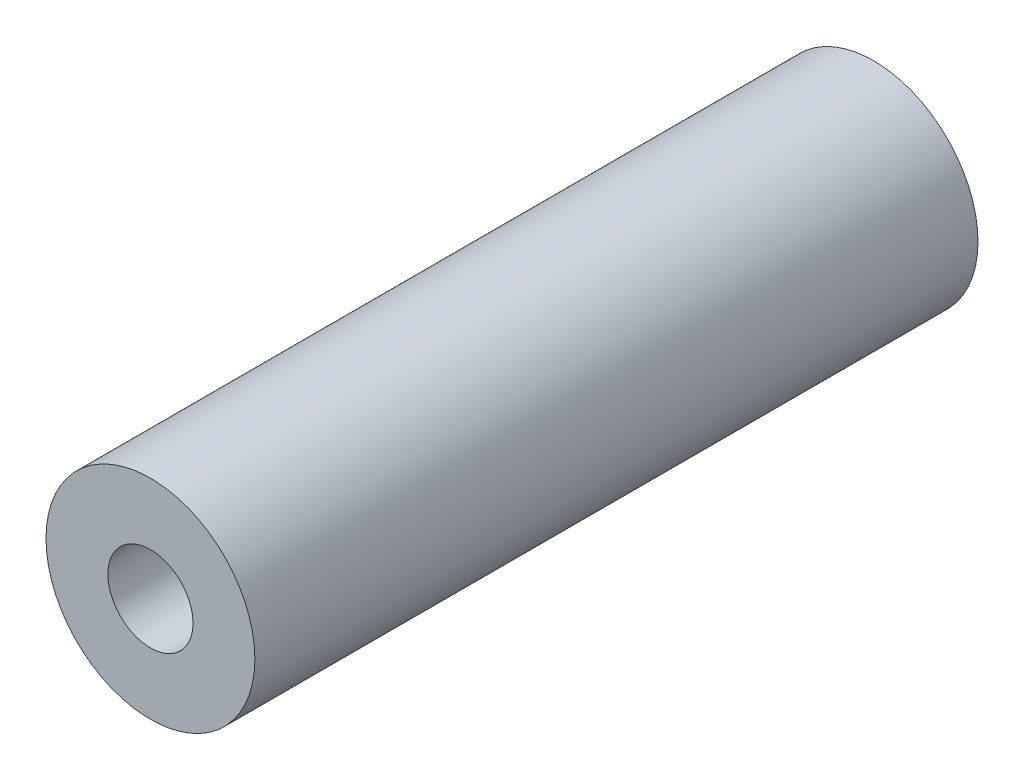
ISO-10303-21;
HEADER;
FILE_DESCRIPTION(('STEP AP214'),'2;1');
FILE_NAME('part.step','',(''),(''),'','','');
FILE_SCHEMA(('AUTOMOTIVE_DESIGN { 1 0 10303 214 1 1 1 1 }'));
ENDSEC;
DATA;
#1=APPLICATION_CONTEXT('core data for automotive mechanical design processes');
#2=APPLICATION_PROTOCOL_DEFINITION('international standard','automotive_design',2000,#1);
#3=PRODUCT_CONTEXT('',#1,'mechanical');
#4=PRODUCT('Part','Part','',(#3));
#5=PRODUCT_RELATED_PRODUCT_CATEGORY('part','',(#4));
#6=PRODUCT_DEFINITION_FORMATION('','',#4);
#7=PRODUCT_DEFINITION_CONTEXT('part definition',#1,'design');
#8=PRODUCT_DEFINITION('design','',#6,#7);
#9=PRODUCT_DEFINITION_SHAPE('','',#8);
#10=(LENGTH_UNIT() NAMED_UNIT(*) SI_UNIT(.MILLI.,.METRE.));
#11=(NAMED_UNIT(*) PLANE_ANGLE_UNIT() SI_UNIT($,.RADIAN.));
#12=(NAMED_UNIT(*) SI_UNIT($,.STERADIAN.) SOLID_ANGLE_UNIT());
#13=UNCERTAINTY_MEASURE_WITH_UNIT(LENGTH_MEASURE(1.E-05),#10,'distance_accuracy_value','');
#14=(GEOMETRIC_REPRESENTATION_CONTEXT(3) GLOBAL_UNCERTAINTY_ASSIGNED_CONTEXT((#13)) GLOBAL_UNIT_ASSIGNED_CONTEXT((#10,
#11,#12)) REPRESENTATION_CONTEXT('',''));
#15=CARTESIAN_POINT('',(0.,0.,0.));
#16=DIRECTION('',(0.,0.,1.));
#17=DIRECTION('',(1.,0.,0.));
#18=AXIS2_PLACEMENT_3D('',#15,#16,#17);
#19=CARTESIAN_POINT('',(0.,0.,22.5));
#20=DIRECTION('',(0.,0.,1.));
#21=DIRECTION('',(1.,0.,0.));
#22=AXIS2_PLACEMENT_3D('',#19,#20,#21);
#23=PLANE('',#22);
#24=CARTESIAN_POINT('',(0.,0.,22.5));
#25=DIRECTION('',(0.,0.,1.));
#26=DIRECTION('',(1.,0.,0.));
#27=AXIS2_PLACEMENT_3D('',#24,#25,#26);
#28=CIRCLE('',#27,6.5);
#29=CARTESIAN_POINT('',(-6.5,0.,22.5));
#30=VERTEX_POINT('',#29);
#31=EDGE_CURVE('E10',#30,#30,#28,.T.);
#32=ORIENTED_EDGE('',*,*,#31,.T.);
#33=EDGE_LOOP('',(#32));
#34=FACE_BOUND('',#33,.T.);
#35=CARTESIAN_POINT('',(0.,0.,22.5));
#36=DIRECTION('',(0.,0.,1.));
#37=DIRECTION('',(1.,0.,0.));
#38=AXIS2_PLACEMENT_3D('',#35,#36,#37);
#39=CIRCLE('',#38,2.65);
#40=CARTESIAN_POINT('',(-2.65,0.,22.5));
#41=VERTEX_POINT('',#40);
#42=EDGE_CURVE('E44',#41,#41,#39,.T.);
#43=ORIENTED_EDGE('',*,*,#42,.F.);
#44=EDGE_LOOP('',(#43));
#45=FACE_BOUND('',#44,.T.);
#46=ADVANCED_FACE('F33',(#34,#45),#23,.T.);
#47=CARTESIAN_POINT('',(0.,0.,-22.5));
#48=DIRECTION('',(0.,0.,1.));
#49=DIRECTION('',(1.,0.,0.));
#50=AXIS2_PLACEMENT_3D('',#47,#48,#49);
#51=PLANE('',#50);
#52=CARTESIAN_POINT('',(0.,0.,-22.5));
#53=DIRECTION('',(0.,0.,1.));
#54=DIRECTION('',(1.,0.,0.));
#55=AXIS2_PLACEMENT_3D('',#52,#53,#54);
#56=CIRCLE('',#55,6.5);
#57=CARTESIAN_POINT('',(-6.5,0.,-22.5));
#58=VERTEX_POINT('',#57);
#59=EDGE_CURVE('E37',#58,#58,#56,.T.);
#60=ORIENTED_EDGE('',*,*,#59,.F.);
#61=EDGE_LOOP('',(#60));
#62=FACE_BOUND('',#61,.T.);
#63=CARTESIAN_POINT('',(0.,0.,-22.5));
#64=DIRECTION('',(0.,0.,1.));
#65=DIRECTION('',(1.,0.,0.));
#66=AXIS2_PLACEMENT_3D('',#63,#64,#65);
#67=CIRCLE('',#66,2.65);
#68=CARTESIAN_POINT('',(-2.65,0.,-22.5));
#69=VERTEX_POINT('',#68);
#70=EDGE_CURVE('E46',#69,#69,#67,.T.);
#71=ORIENTED_EDGE('',*,*,#70,.T.);
#72=EDGE_LOOP('',(#71));
#73=FACE_BOUND('',#72,.T.);
#74=ADVANCED_FACE('F56',(#62,#73),#51,.F.);
#75=CARTESIAN_POINT('',(0.,0.,22.5));
#76=DIRECTION('',(0.,0.,-1.));
#77=DIRECTION('',(-1.,0.,0.));
#78=AXIS2_PLACEMENT_3D('',#75,#76,#77);
#79=CYLINDRICAL_SURFACE('',#78,6.5);
#80=CARTESIAN_POINT('',(-6.5,0.,22.5));
#81=CARTESIAN_POINT('',(-6.5,0.,22.03125));
#82=CARTESIAN_POINT('',(-6.5,0.,21.5625));
#83=CARTESIAN_POINT('',(-6.5,0.,20.625));
#84=CARTESIAN_POINT('',(-6.5,0.,20.15625));
#85=CARTESIAN_POINT('',(-6.5,0.,19.21875));
#86=CARTESIAN_POINT('',(-6.5,0.,18.75));
#87=CARTESIAN_POINT('',(-6.5,0.,17.8125));
#88=CARTESIAN_POINT('',(-6.5,0.,17.34375));
#89=CARTESIAN_POINT('',(-6.5,0.,16.40625));
#90=CARTESIAN_POINT('',(-6.5,0.,15.9375));
#91=CARTESIAN_POINT('',(-6.5,0.,15.));
#92=CARTESIAN_POINT('',(-6.5,0.,14.53125));
#93=CARTESIAN_POINT('',(-6.5,0.,13.59375));
#94=CARTESIAN_POINT('',(-6.5,0.,13.125));
#95=CARTESIAN_POINT('',(-6.5,0.,12.1875));
#96=CARTESIAN_POINT('',(-6.5,0.,11.71875));
#97=CARTESIAN_POINT('',(-6.5,0.,10.78125));
#98=CARTESIAN_POINT('',(-6.5,0.,10.3125));
#99=CARTESIAN_POINT('',(-6.5,0.,9.37499999999999));
#100=CARTESIAN_POINT('',(-6.5,0.,8.90625));
#101=CARTESIAN_POINT('',(-6.5,0.,7.96874999999999));
#102=CARTESIAN_POINT('',(-6.5,0.,7.5));
#103=CARTESIAN_POINT('',(-6.5,0.,6.5625));
#104=CARTESIAN_POINT('',(-6.5,0.,6.09374999999999));
#105=CARTESIAN_POINT('',(-6.5,0.,5.15624999999999));
#106=CARTESIAN_POINT('',(-6.5,0.,4.68749999999999));
#107=CARTESIAN_POINT('',(-6.5,0.,3.74999999999999));
#108=CARTESIAN_POINT('',(-6.5,0.,3.28124999999999));
#109=CARTESIAN_POINT('',(-6.5,0.,2.34375));
#110=CARTESIAN_POINT('',(-6.5,0.,1.87499999999999));
#111=CARTESIAN_POINT('',(-6.5,0.,0.937499999999994));
#112=CARTESIAN_POINT('',(-6.5,0.,0.468749999999993));
#113=CARTESIAN_POINT('',(-6.5,0.,-0.468750000000007));
#114=CARTESIAN_POINT('',(-6.5,0.,-0.937500000000008));
#115=CARTESIAN_POINT('',(-6.5,0.,-1.87500000000001));
#116=CARTESIAN_POINT('',(-6.5,0.,-2.34375000000001));
#117=CARTESIAN_POINT('',(-6.5,0.,-3.28125000000001));
#118=CARTESIAN_POINT('',(-6.5,0.,-3.75000000000001));
#119=CARTESIAN_POINT('',(-6.5,0.,-4.68750000000001));
#120=CARTESIAN_POINT('',(-6.5,0.,-5.15625000000001));
#121=CARTESIAN_POINT('',(-6.5,0.,-6.09375000000001));
#122=CARTESIAN_POINT('',(-6.5,0.,-6.56250000000001));
#123=CARTESIAN_POINT('',(-6.5,0.,-7.50000000000001));
#124=CARTESIAN_POINT('',(-6.5,0.,-7.96875000000001));
#125=CARTESIAN_POINT('',(-6.5,0.,-8.90625000000001));
#126=CARTESIAN_POINT('',(-6.5,0.,-9.37500000000001));
#127=CARTESIAN_POINT('',(-6.5,0.,-10.3125));
#128=CARTESIAN_POINT('',(-6.5,0.,-10.78125));
#129=CARTESIAN_POINT('',(-6.5,0.,-11.71875));
#130=CARTESIAN_POINT('',(-6.5,0.,-12.1875));
#131=CARTESIAN_POINT('',(-6.5,0.,-13.125));
#132=CARTESIAN_POINT('',(-6.5,0.,-13.59375));
#133=CARTESIAN_POINT('',(-6.5,0.,-14.53125));
#134=CARTESIAN_POINT('',(-6.5,0.,-15.));
#135=CARTESIAN_POINT('',(-6.5,0.,-15.9375));
#136=CARTESIAN_POINT('',(-6.5,0.,-16.40625));
#137=CARTESIAN_POINT('',(-6.5,0.,-17.34375));
#138=CARTESIAN_POINT('',(-6.5,0.,-17.8125));
#139=CARTESIAN_POINT('',(-6.5,0.,-18.75));
#140=CARTESIAN_POINT('',(-6.5,0.,-19.21875));
#141=CARTESIAN_POINT('',(-6.5,0.,-20.15625));
#142=CARTESIAN_POINT('',(-6.5,0.,-20.625));
#143=CARTESIAN_POINT('',(-6.5,0.,-21.5625));
#144=CARTESIAN_POINT('',(-6.5,0.,-22.03125));
#145=CARTESIAN_POINT('',(-6.5,0.,-22.5));
#146=B_SPLINE_CURVE_WITH_KNOTS('',3,(#80,#81,#82,#83,#84,#85,#86,#87,#88,#89,#90,#91,#92,#93,
#94,#95,#96,#97,#98,#99,#100,#101,#102,#103,#104,#105,#106,#107,#108,#109,#110,#111,#112,#113,
#114,#115,#116,#117,#118,#119,#120,#121,#122,#123,#124,#125,#126,#127,#128,#129,#130,#131,#132,
#133,#134,#135,#136,#137,#138,#139,#140,#141,#142,#143,#144,#145),.UNSPECIFIED.,.F.,.F.,(4,2,2,
2,2,2,2,2,2,2,2,2,2,2,2,2,2,2,2,2,2,2,2,2,2,2,2,2,2,2,2,2,4),(0.,1.40625,2.8125,4.21875,5.625,
7.03125,8.4375,9.84375,11.25,12.65625,14.0625,15.46875,16.875,18.28125,19.6875,21.09375,22.5,
23.90625,25.3125,26.71875,28.125,29.53125,30.9375,32.34375,33.75,35.15625,36.5625,37.96875,
39.375,40.78125,42.1875,43.59375,45.),.UNSPECIFIED.);
#147=EDGE_CURVE('BSEAM35',#30,#58,#146,.T.);
#148=ORIENTED_EDGE('',*,*,#31,.F.);
#149=ORIENTED_EDGE('',*,*,#59,.T.);
#150=ORIENTED_EDGE('',*,*,#147,.T.);
#151=ORIENTED_EDGE('',*,*,#147,.F.);
#152=EDGE_LOOP('',(#148,#150,#149,#151));
#153=FACE_BOUND('',#152,.T.);
#154=ADVANCED_FACE('F35',(#153),#79,.T.);
#155=CARTESIAN_POINT('',(0.,0.,22.5));
#156=DIRECTION('',(0.,0.,-1.));
#157=DIRECTION('',(-1.,0.,0.));
#158=AXIS2_PLACEMENT_3D('',#155,#156,#157);
#159=CYLINDRICAL_SURFACE('',#158,2.65);
#160=CARTESIAN_POINT('',(-2.65,0.,22.5));
#161=CARTESIAN_POINT('',(-2.65,0.,22.03125));
#162=CARTESIAN_POINT('',(-2.65,0.,21.5625));
#163=CARTESIAN_POINT('',(-2.65,0.,20.625));
#164=CARTESIAN_POINT('',(-2.65,0.,20.15625));
#165=CARTESIAN_POINT('',(-2.65,0.,19.21875));
#166=CARTESIAN_POINT('',(-2.65,0.,18.75));
#167=CARTESIAN_POINT('',(-2.65,0.,17.8125));
#168=CARTESIAN_POINT('',(-2.65,0.,17.34375));
#169=CARTESIAN_POINT('',(-2.65,0.,16.40625));
#170=CARTESIAN_POINT('',(-2.65,0.,15.9375));
#171=CARTESIAN_POINT('',(-2.65,0.,15.));
#172=CARTESIAN_POINT('',(-2.65,0.,14.53125));
#173=CARTESIAN_POINT('',(-2.65,0.,13.59375));
#174=CARTESIAN_POINT('',(-2.65,0.,13.125));
#175=CARTESIAN_POINT('',(-2.65,0.,12.1875));
#176=CARTESIAN_POINT('',(-2.65,0.,11.71875));
#177=CARTESIAN_POINT('',(-2.65,0.,10.78125));
#178=CARTESIAN_POINT('',(-2.65,0.,10.3125));
#179=CARTESIAN_POINT('',(-2.65,0.,9.37499999999999));
#180=CARTESIAN_POINT('',(-2.65,0.,8.90625));
#181=CARTESIAN_POINT('',(-2.65,0.,7.96874999999999));
#182=CARTESIAN_POINT('',(-2.65,0.,7.5));
#183=CARTESIAN_POINT('',(-2.65,0.,6.5625));
#184=CARTESIAN_POINT('',(-2.65,0.,6.09375));
#185=CARTESIAN_POINT('',(-2.65,0.,5.15625));
#186=CARTESIAN_POINT('',(-2.65,0.,4.6875));
#187=CARTESIAN_POINT('',(-2.65,0.,3.75));
#188=CARTESIAN_POINT('',(-2.65,0.,3.28125));
#189=CARTESIAN_POINT('',(-2.65,0.,2.34375));
#190=CARTESIAN_POINT('',(-2.65,0.,1.875));
#191=CARTESIAN_POINT('',(-2.65,0.,0.937499999999997));
#192=CARTESIAN_POINT('',(-2.65,0.,0.468749999999997));
#193=CARTESIAN_POINT('',(-2.65,0.,-0.468750000000004));
#194=CARTESIAN_POINT('',(-2.65,0.,-0.937500000000004));
#195=CARTESIAN_POINT('',(-2.65,0.,-1.87500000000001));
#196=CARTESIAN_POINT('',(-2.65,0.,-2.34375000000001));
#197=CARTESIAN_POINT('',(-2.65,0.,-3.28125));
#198=CARTESIAN_POINT('',(-2.65,0.,-3.75));
#199=CARTESIAN_POINT('',(-2.65,0.,-4.6875));
#200=CARTESIAN_POINT('',(-2.65,0.,-5.15625));
#201=CARTESIAN_POINT('',(-2.65,0.,-6.09375000000001));
#202=CARTESIAN_POINT('',(-2.65,0.,-6.56250000000001));
#203=CARTESIAN_POINT('',(-2.65,0.,-7.50000000000001));
#204=CARTESIAN_POINT('',(-2.65,0.,-7.96875000000001));
#205=CARTESIAN_POINT('',(-2.65,0.,-8.90625));
#206=CARTESIAN_POINT('',(-2.65,0.,-9.37500000000001));
#207=CARTESIAN_POINT('',(-2.65,0.,-10.3125));
#208=CARTESIAN_POINT('',(-2.65,0.,-10.78125));
#209=CARTESIAN_POINT('',(-2.65,0.,-11.71875));
#210=CARTESIAN_POINT('',(-2.65,0.,-12.1875));
#211=CARTESIAN_POINT('',(-2.65,0.,-13.125));
#212=CARTESIAN_POINT('',(-2.65,0.,-13.59375));
#213=CARTESIAN_POINT('',(-2.65,0.,-14.53125));
#214=CARTESIAN_POINT('',(-2.65,0.,-15.));
#215=CARTESIAN_POINT('',(-2.65,0.,-15.9375));
#216=CARTESIAN_POINT('',(-2.65,0.,-16.40625));
#217=CARTESIAN_POINT('',(-2.65,0.,-17.34375));
#218=CARTESIAN_POINT('',(-2.65,0.,-17.8125));
#219=CARTESIAN_POINT('',(-2.65,0.,-18.75));
#220=CARTESIAN_POINT('',(-2.65,0.,-19.21875));
#221=CARTESIAN_POINT('',(-2.65,0.,-20.15625));
#222=CARTESIAN_POINT('',(-2.65,0.,-20.625));
#223=CARTESIAN_POINT('',(-2.65,0.,-21.5625));
#224=CARTESIAN_POINT('',(-2.65,0.,-22.03125));
#225=CARTESIAN_POINT('',(-2.65,0.,-22.5));
#226=B_SPLINE_CURVE_WITH_KNOTS('',3,(#160,#161,#162,#163,#164,#165,#166,#167,#168,#169,#170,
#171,#172,#173,#174,#175,#176,#177,#178,#179,#180,#181,#182,#183,#184,#185,#186,#187,#188,#189,
#190,#191,#192,#193,#194,#195,#196,#197,#198,#199,#200,#201,#202,#203,#204,#205,#206,#207,#208,
#209,#210,#211,#212,#213,#214,#215,#216,#217,#218,#219,#220,#221,#222,#223,#224,#225),
.UNSPECIFIED.,.F.,.F.,(4,2,2,2,2,2,2,2,2,2,2,2,2,2,2,2,2,2,2,2,2,2,2,2,2,2,2,2,2,2,2,2,4),(0.,
1.40625,2.8125,4.21875,5.625,7.03125,8.4375,9.84375,11.25,12.65625,14.0625,15.46875,16.875,
18.28125,19.6875,21.09375,22.5,23.90625,25.3125,26.71875,28.125,29.53125,30.9375,32.34375,33.75,
35.15625,36.5625,37.96875,39.375,40.78125,42.1875,43.59375,45.),.UNSPECIFIED.);
#227=EDGE_CURVE('BSEAM52',#41,#69,#226,.T.);
#228=ORIENTED_EDGE('',*,*,#42,.T.);
#229=ORIENTED_EDGE('',*,*,#70,.F.);
#230=ORIENTED_EDGE('',*,*,#227,.T.);
#231=ORIENTED_EDGE('',*,*,#227,.F.);
#232=EDGE_LOOP('',(#228,#230,#229,#231));
#233=FACE_BOUND('',#232,.T.);
#234=ADVANCED_FACE('F52',(#233),#159,.F.);
#235=CLOSED_SHELL('',(#46,#74,#154,#234));
#236=MANIFOLD_SOLID_BREP('B2',#235);
#237=ADVANCED_BREP_SHAPE_REPRESENTATION('',(#18,#236),#14);
#238=SHAPE_DEFINITION_REPRESENTATION(#9,#237);
ENDSEC;
END-ISO-10303-21;
